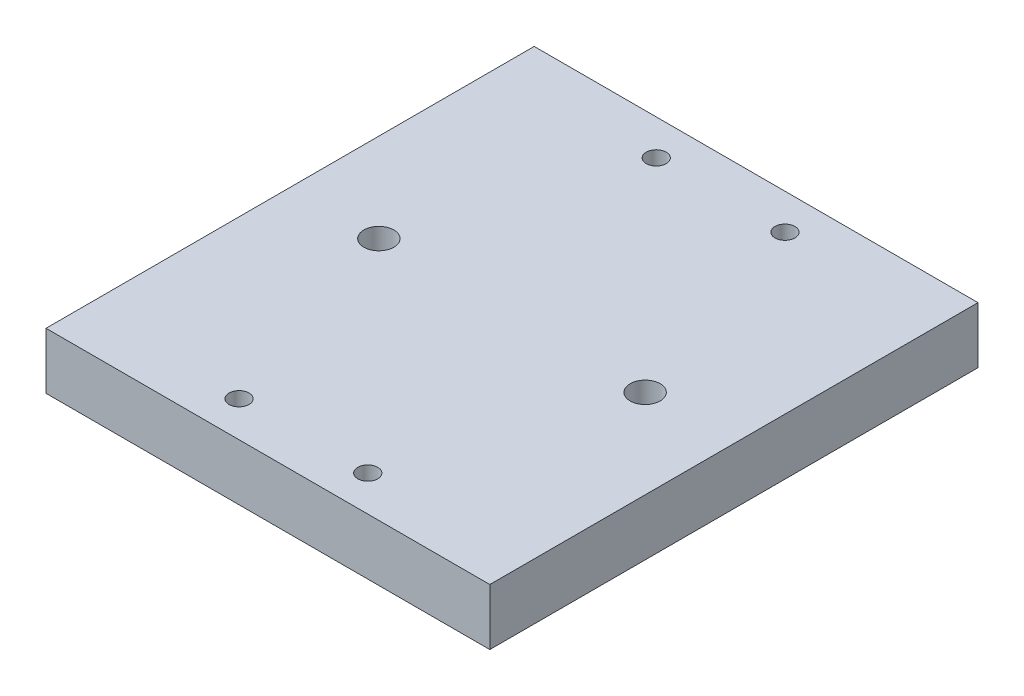
ISO-10303-21;
HEADER;
FILE_DESCRIPTION(('STEP AP214'),'2;1');
FILE_NAME('part.step','',(''),(''),'','','');
FILE_SCHEMA(('AUTOMOTIVE_DESIGN { 1 0 10303 214 1 1 1 1 }'));
ENDSEC;
DATA;
#1=APPLICATION_CONTEXT('core data for automotive mechanical design processes');
#2=APPLICATION_PROTOCOL_DEFINITION('international standard','automotive_design',2000,#1);
#3=PRODUCT_CONTEXT('',#1,'mechanical');
#4=PRODUCT('Part','Part','',(#3));
#5=PRODUCT_RELATED_PRODUCT_CATEGORY('part','',(#4));
#6=PRODUCT_DEFINITION_FORMATION('','',#4);
#7=PRODUCT_DEFINITION_CONTEXT('part definition',#1,'design');
#8=PRODUCT_DEFINITION('design','',#6,#7);
#9=PRODUCT_DEFINITION_SHAPE('','',#8);
#10=(LENGTH_UNIT() NAMED_UNIT(*) SI_UNIT(.MILLI.,.METRE.));
#11=(NAMED_UNIT(*) PLANE_ANGLE_UNIT() SI_UNIT($,.RADIAN.));
#12=(NAMED_UNIT(*) SI_UNIT($,.STERADIAN.) SOLID_ANGLE_UNIT());
#13=UNCERTAINTY_MEASURE_WITH_UNIT(LENGTH_MEASURE(1.E-05),#10,'distance_accuracy_value','');
#14=(GEOMETRIC_REPRESENTATION_CONTEXT(3) GLOBAL_UNCERTAINTY_ASSIGNED_CONTEXT((#13)) GLOBAL_UNIT_ASSIGNED_CONTEXT((#10,
#11,#12)) REPRESENTATION_CONTEXT('',''));
#15=CARTESIAN_POINT('',(0.,0.,0.));
#16=DIRECTION('',(0.,0.,1.));
#17=DIRECTION('',(1.,0.,0.));
#18=AXIS2_PLACEMENT_3D('',#15,#16,#17);
#19=CARTESIAN_POINT('',(-50.,6.35,55.));
#20=DIRECTION('',(1.,0.,0.));
#21=DIRECTION('',(0.,0.,-1.));
#22=AXIS2_PLACEMENT_3D('',#19,#20,#21);
#23=PLANE('',#22);
#24=DIRECTION('',(0.,-1.,0.));
#25=VECTOR('',#24,1.);
#26=CARTESIAN_POINT('',(-50.,6.35,-55.));
#27=LINE('',#26,#25);
#28=CARTESIAN_POINT('',(-50.,6.35,-55.));
#29=VERTEX_POINT('',#28);
#30=CARTESIAN_POINT('',(-50.,-6.35,-55.));
#31=VERTEX_POINT('',#30);
#32=EDGE_CURVE('E96',#29,#31,#27,.T.);
#33=ORIENTED_EDGE('',*,*,#32,.T.);
#34=DIRECTION('',(0.,0.,-1.));
#35=VECTOR('',#34,1.);
#36=CARTESIAN_POINT('',(-50.,-6.35,55.));
#37=LINE('',#36,#35);
#38=CARTESIAN_POINT('',(-50.,-6.35,55.));
#39=VERTEX_POINT('',#38);
#40=EDGE_CURVE('E11',#39,#31,#37,.T.);
#41=ORIENTED_EDGE('',*,*,#40,.F.);
#42=DIRECTION('',(0.,-1.,0.));
#43=VECTOR('',#42,1.);
#44=CARTESIAN_POINT('',(-50.,6.35,55.));
#45=LINE('',#44,#43);
#46=CARTESIAN_POINT('',(-50.,6.35,55.));
#47=VERTEX_POINT('',#46);
#48=EDGE_CURVE('E84',#47,#39,#45,.T.);
#49=ORIENTED_EDGE('',*,*,#48,.F.);
#50=DIRECTION('',(0.,0.,-1.));
#51=VECTOR('',#50,1.);
#52=CARTESIAN_POINT('',(-50.,6.35,55.));
#53=LINE('',#52,#51);
#54=EDGE_CURVE('E92',#47,#29,#53,.T.);
#55=ORIENTED_EDGE('',*,*,#54,.T.);
#56=EDGE_LOOP('',(#33,#41,#49,#55));
#57=FACE_BOUND('',#56,.T.);
#58=ADVANCED_FACE('F33',(#57),#23,.F.);
#59=CARTESIAN_POINT('',(50.,-6.34999999999999,55.));
#60=DIRECTION('',(0.,1.,0.));
#61=DIRECTION('',(-1.,0.,0.));
#62=AXIS2_PLACEMENT_3D('',#59,#60,#61);
#63=PLANE('',#62);
#64=CARTESIAN_POINT('',(-30.0000078911007,-6.35,-1.67118388853208E-06));
#65=DIRECTION('',(0.,-1.,0.));
#66=DIRECTION('',(0.,0.,-1.));
#67=AXIS2_PLACEMENT_3D('',#64,#65,#66);
#68=CIRCLE('',#67,5.55625);
#69=CARTESIAN_POINT('',(-30.0000078911007,-6.35,-5.55625167118389));
#70=VERTEX_POINT('',#69);
#71=EDGE_CURVE('E154',#70,#70,#68,.T.);
#72=ORIENTED_EDGE('',*,*,#71,.F.);
#73=EDGE_LOOP('',(#72));
#74=FACE_BOUND('',#73,.T.);
#75=CARTESIAN_POINT('',(29.9999921088993,-6.34999999999999,-1.67118389491202E-06));
#76=DIRECTION('',(0.,-1.,0.));
#77=DIRECTION('',(0.,0.,-1.));
#78=AXIS2_PLACEMENT_3D('',#75,#76,#77);
#79=CIRCLE('',#78,5.55625);
#80=CARTESIAN_POINT('',(29.9999921088993,-6.34999999999999,-5.55625167118389));
#81=VERTEX_POINT('',#80);
#82=EDGE_CURVE('E142',#81,#81,#79,.T.);
#83=ORIENTED_EDGE('',*,*,#82,.F.);
#84=EDGE_LOOP('',(#83));
#85=FACE_BOUND('',#84,.T.);
#86=CARTESIAN_POINT('',(14.5,-6.35000000000001,47.));
#87=DIRECTION('',(0.,1.,0.));
#88=DIRECTION('',(0.,0.,1.));
#89=AXIS2_PLACEMENT_3D('',#86,#87,#88);
#90=CIRCLE('',#89,2.25);
#91=CARTESIAN_POINT('',(14.5,-6.35000000000001,49.25));
#92=VERTEX_POINT('',#91);
#93=EDGE_CURVE('E127',#92,#92,#90,.T.);
#94=ORIENTED_EDGE('',*,*,#93,.T.);
#95=EDGE_LOOP('',(#94));
#96=FACE_BOUND('',#95,.T.);
#97=CARTESIAN_POINT('',(-14.5,-6.35000000000001,47.0000000000001));
#98=DIRECTION('',(0.,1.,0.));
#99=DIRECTION('',(0.,0.,1.));
#100=AXIS2_PLACEMENT_3D('',#97,#98,#99);
#101=CIRCLE('',#100,2.25);
#102=CARTESIAN_POINT('',(-14.5,-6.35000000000001,49.2500000000001));
#103=VERTEX_POINT('',#102);
#104=EDGE_CURVE('E121',#103,#103,#101,.T.);
#105=ORIENTED_EDGE('',*,*,#104,.T.);
#106=EDGE_LOOP('',(#105));
#107=FACE_BOUND('',#106,.T.);
#108=CARTESIAN_POINT('',(-14.5,-6.35000000000001,-46.9999999999999));
#109=DIRECTION('',(0.,1.,0.));
#110=DIRECTION('',(0.,0.,1.));
#111=AXIS2_PLACEMENT_3D('',#108,#109,#110);
#112=CIRCLE('',#111,2.25);
#113=CARTESIAN_POINT('',(-14.5,-6.35000000000001,-44.7499999999999));
#114=VERTEX_POINT('',#113);
#115=EDGE_CURVE('E115',#114,#114,#112,.T.);
#116=ORIENTED_EDGE('',*,*,#115,.T.);
#117=EDGE_LOOP('',(#116));
#118=FACE_BOUND('',#117,.T.);
#119=CARTESIAN_POINT('',(14.5,-6.35000000000001,-47.));
#120=DIRECTION('',(0.,1.,0.));
#121=DIRECTION('',(0.,0.,1.));
#122=AXIS2_PLACEMENT_3D('',#119,#120,#121);
#123=CIRCLE('',#122,2.25);
#124=CARTESIAN_POINT('',(14.5,-6.35000000000001,-44.75));
#125=VERTEX_POINT('',#124);
#126=EDGE_CURVE('E99',#125,#125,#123,.T.);
#127=ORIENTED_EDGE('',*,*,#126,.T.);
#128=EDGE_LOOP('',(#127));
#129=FACE_BOUND('',#128,.T.);
#130=DIRECTION('',(1.,0.,0.));
#131=VECTOR('',#130,1.);
#132=CARTESIAN_POINT('',(50.,-6.34999999999999,-55.));
#133=LINE('',#132,#131);
#134=CARTESIAN_POINT('',(50.,-6.34999999999999,-55.));
#135=VERTEX_POINT('',#134);
#136=EDGE_CURVE('E88',#31,#135,#133,.T.);
#137=ORIENTED_EDGE('',*,*,#136,.T.);
#138=DIRECTION('',(0.,0.,-1.));
#139=VECTOR('',#138,1.);
#140=CARTESIAN_POINT('',(50.,-6.34999999999999,55.));
#141=LINE('',#140,#139);
#142=CARTESIAN_POINT('',(50.,-6.34999999999999,55.));
#143=VERTEX_POINT('',#142);
#144=EDGE_CURVE('E41',#143,#135,#141,.T.);
#145=ORIENTED_EDGE('',*,*,#144,.F.);
#146=DIRECTION('',(1.,0.,0.));
#147=VECTOR('',#146,1.);
#148=CARTESIAN_POINT('',(50.,-6.34999999999999,55.));
#149=LINE('',#148,#147);
#150=EDGE_CURVE('E79',#39,#143,#149,.T.);
#151=ORIENTED_EDGE('',*,*,#150,.F.);
#152=ORIENTED_EDGE('',*,*,#40,.T.);
#153=EDGE_LOOP('',(#137,#145,#151,#152));
#154=FACE_BOUND('',#153,.T.);
#155=ADVANCED_FACE('F87',(#74,#85,#96,#107,#118,#129,#154),#63,.F.);
#156=CARTESIAN_POINT('',(50.,6.35000000000001,55.));
#157=DIRECTION('',(-1.,0.,0.));
#158=DIRECTION('',(0.,0.,1.));
#159=AXIS2_PLACEMENT_3D('',#156,#157,#158);
#160=PLANE('',#159);
#161=DIRECTION('',(0.,1.,0.));
#162=VECTOR('',#161,1.);
#163=CARTESIAN_POINT('',(50.,6.35000000000001,-55.));
#164=LINE('',#163,#162);
#165=CARTESIAN_POINT('',(50.,6.35000000000001,-55.));
#166=VERTEX_POINT('',#165);
#167=EDGE_CURVE('E66',#135,#166,#164,.T.);
#168=ORIENTED_EDGE('',*,*,#167,.T.);
#169=DIRECTION('',(0.,0.,-1.));
#170=VECTOR('',#169,1.);
#171=CARTESIAN_POINT('',(50.,6.35000000000001,55.));
#172=LINE('',#171,#170);
#173=CARTESIAN_POINT('',(50.,6.35000000000001,55.));
#174=VERTEX_POINT('',#173);
#175=EDGE_CURVE('E89',#174,#166,#172,.T.);
#176=ORIENTED_EDGE('',*,*,#175,.F.);
#177=DIRECTION('',(0.,1.,0.));
#178=VECTOR('',#177,1.);
#179=CARTESIAN_POINT('',(50.,6.35000000000001,55.));
#180=LINE('',#179,#178);
#181=EDGE_CURVE('E82',#143,#174,#180,.T.);
#182=ORIENTED_EDGE('',*,*,#181,.F.);
#183=ORIENTED_EDGE('',*,*,#144,.T.);
#184=EDGE_LOOP('',(#168,#176,#182,#183));
#185=FACE_BOUND('',#184,.T.);
#186=ADVANCED_FACE('F90',(#185),#160,.F.);
#187=CARTESIAN_POINT('',(50.,6.35000000000001,55.));
#188=DIRECTION('',(0.,-1.,0.));
#189=DIRECTION('',(1.,0.,0.));
#190=AXIS2_PLACEMENT_3D('',#187,#188,#189);
#191=PLANE('',#190);
#192=CARTESIAN_POINT('',(-30.0000078911007,6.35000000000013,-1.67118388853208E-06));
#193=DIRECTION('',(0.,-1.,0.));
#194=DIRECTION('',(0.,0.,-1.));
#195=AXIS2_PLACEMENT_3D('',#192,#193,#194);
#196=CIRCLE('',#195,3.3782);
#197=CARTESIAN_POINT('',(-30.0000078911007,6.35000000000013,-3.37820167118389));
#198=VERTEX_POINT('',#197);
#199=EDGE_CURVE('E145',#198,#198,#196,.T.);
#200=ORIENTED_EDGE('',*,*,#199,.T.);
#201=EDGE_LOOP('',(#200));
#202=FACE_BOUND('',#201,.T.);
#203=CARTESIAN_POINT('',(29.9999921088993,6.35000000000014,-1.67118389491202E-06));
#204=DIRECTION('',(0.,-1.,0.));
#205=DIRECTION('',(0.,0.,-1.));
#206=AXIS2_PLACEMENT_3D('',#203,#204,#205);
#207=CIRCLE('',#206,3.3782);
#208=CARTESIAN_POINT('',(29.9999921088993,6.35000000000014,-3.37820167118389));
#209=VERTEX_POINT('',#208);
#210=EDGE_CURVE('E133',#209,#209,#207,.T.);
#211=ORIENTED_EDGE('',*,*,#210,.T.);
#212=EDGE_LOOP('',(#211));
#213=FACE_BOUND('',#212,.T.);
#214=CARTESIAN_POINT('',(14.5,6.35,47.));
#215=DIRECTION('',(0.,1.,0.));
#216=DIRECTION('',(0.,0.,1.));
#217=AXIS2_PLACEMENT_3D('',#214,#215,#216);
#218=CIRCLE('',#217,2.24999999999999);
#219=CARTESIAN_POINT('',(14.5,6.35,49.25));
#220=VERTEX_POINT('',#219);
#221=EDGE_CURVE('E130',#220,#220,#218,.T.);
#222=ORIENTED_EDGE('',*,*,#221,.F.);
#223=EDGE_LOOP('',(#222));
#224=FACE_BOUND('',#223,.T.);
#225=CARTESIAN_POINT('',(-14.5,6.35,47.0000000000001));
#226=DIRECTION('',(0.,1.,0.));
#227=DIRECTION('',(0.,0.,1.));
#228=AXIS2_PLACEMENT_3D('',#225,#226,#227);
#229=CIRCLE('',#228,2.24999999999999);
#230=CARTESIAN_POINT('',(-14.5,6.35,49.2500000000001));
#231=VERTEX_POINT('',#230);
#232=EDGE_CURVE('E124',#231,#231,#229,.T.);
#233=ORIENTED_EDGE('',*,*,#232,.F.);
#234=EDGE_LOOP('',(#233));
#235=FACE_BOUND('',#234,.T.);
#236=CARTESIAN_POINT('',(-14.5,6.35,-46.9999999999999));
#237=DIRECTION('',(0.,1.,0.));
#238=DIRECTION('',(0.,0.,1.));
#239=AXIS2_PLACEMENT_3D('',#236,#237,#238);
#240=CIRCLE('',#239,2.24999999999999);
#241=CARTESIAN_POINT('',(-14.5,6.35,-44.7499999999999));
#242=VERTEX_POINT('',#241);
#243=EDGE_CURVE('E118',#242,#242,#240,.T.);
#244=ORIENTED_EDGE('',*,*,#243,.F.);
#245=EDGE_LOOP('',(#244));
#246=FACE_BOUND('',#245,.T.);
#247=CARTESIAN_POINT('',(14.5,6.35,-47.));
#248=DIRECTION('',(0.,1.,0.));
#249=DIRECTION('',(0.,0.,1.));
#250=AXIS2_PLACEMENT_3D('',#247,#248,#249);
#251=CIRCLE('',#250,2.24999999999999);
#252=CARTESIAN_POINT('',(14.5,6.35,-44.75));
#253=VERTEX_POINT('',#252);
#254=EDGE_CURVE('E112',#253,#253,#251,.T.);
#255=ORIENTED_EDGE('',*,*,#254,.F.);
#256=EDGE_LOOP('',(#255));
#257=FACE_BOUND('',#256,.T.);
#258=DIRECTION('',(-1.,0.,0.));
#259=VECTOR('',#258,1.);
#260=CARTESIAN_POINT('',(50.,6.35000000000001,-55.));
#261=LINE('',#260,#259);
#262=EDGE_CURVE('E72',#166,#29,#261,.T.);
#263=ORIENTED_EDGE('',*,*,#262,.T.);
#264=ORIENTED_EDGE('',*,*,#54,.F.);
#265=DIRECTION('',(-1.,0.,0.));
#266=VECTOR('',#265,1.);
#267=CARTESIAN_POINT('',(50.,6.35000000000001,55.));
#268=LINE('',#267,#266);
#269=EDGE_CURVE('E49',#174,#47,#268,.T.);
#270=ORIENTED_EDGE('',*,*,#269,.F.);
#271=ORIENTED_EDGE('',*,*,#175,.T.);
#272=EDGE_LOOP('',(#263,#264,#270,#271));
#273=FACE_BOUND('',#272,.T.);
#274=ADVANCED_FACE('F104',(#202,#213,#224,#235,#246,#257,#273),#191,.F.);
#275=CARTESIAN_POINT('',(0.,0.,55.));
#276=DIRECTION('',(0.,0.,-1.));
#277=DIRECTION('',(-1.,0.,0.));
#278=AXIS2_PLACEMENT_3D('',#275,#276,#277);
#279=PLANE('',#278);
#280=ORIENTED_EDGE('',*,*,#48,.T.);
#281=ORIENTED_EDGE('',*,*,#150,.T.);
#282=ORIENTED_EDGE('',*,*,#181,.T.);
#283=ORIENTED_EDGE('',*,*,#269,.T.);
#284=EDGE_LOOP('',(#280,#281,#282,#283));
#285=FACE_BOUND('',#284,.T.);
#286=ADVANCED_FACE('F80',(#285),#279,.F.);
#287=CARTESIAN_POINT('',(0.,0.,-55.));
#288=DIRECTION('',(0.,0.,-1.));
#289=DIRECTION('',(-1.,0.,0.));
#290=AXIS2_PLACEMENT_3D('',#287,#288,#289);
#291=PLANE('',#290);
#292=ORIENTED_EDGE('',*,*,#32,.F.);
#293=ORIENTED_EDGE('',*,*,#262,.F.);
#294=ORIENTED_EDGE('',*,*,#167,.F.);
#295=ORIENTED_EDGE('',*,*,#136,.F.);
#296=EDGE_LOOP('',(#292,#293,#294,#295));
#297=FACE_BOUND('',#296,.T.);
#298=ADVANCED_FACE('F107',(#297),#291,.T.);
#299=CARTESIAN_POINT('',(14.5,6.35,-47.));
#300=DIRECTION('',(0.,1.,0.));
#301=DIRECTION('',(0.,0.,1.));
#302=AXIS2_PLACEMENT_3D('',#299,#300,#301);
#303=CYLINDRICAL_SURFACE('',#302,2.24999999999999);
#304=ORIENTED_EDGE('',*,*,#126,.F.);
#305=EDGE_LOOP('',(#304));
#306=FACE_BOUND('',#305,.T.);
#307=ORIENTED_EDGE('',*,*,#254,.T.);
#308=EDGE_LOOP('',(#307));
#309=FACE_BOUND('',#308,.T.);
#310=ADVANCED_FACE('F172',(#306,#309),#303,.F.);
#311=CARTESIAN_POINT('',(-14.5,6.35,-46.9999999999999));
#312=DIRECTION('',(0.,1.,0.));
#313=DIRECTION('',(0.,0.,1.));
#314=AXIS2_PLACEMENT_3D('',#311,#312,#313);
#315=CYLINDRICAL_SURFACE('',#314,2.24999999999999);
#316=ORIENTED_EDGE('',*,*,#115,.F.);
#317=EDGE_LOOP('',(#316));
#318=FACE_BOUND('',#317,.T.);
#319=ORIENTED_EDGE('',*,*,#243,.T.);
#320=EDGE_LOOP('',(#319));
#321=FACE_BOUND('',#320,.T.);
#322=ADVANCED_FACE('F175',(#318,#321),#315,.F.);
#323=CARTESIAN_POINT('',(-14.5,6.35,47.0000000000001));
#324=DIRECTION('',(0.,1.,0.));
#325=DIRECTION('',(0.,0.,1.));
#326=AXIS2_PLACEMENT_3D('',#323,#324,#325);
#327=CYLINDRICAL_SURFACE('',#326,2.24999999999999);
#328=ORIENTED_EDGE('',*,*,#104,.F.);
#329=EDGE_LOOP('',(#328));
#330=FACE_BOUND('',#329,.T.);
#331=ORIENTED_EDGE('',*,*,#232,.T.);
#332=EDGE_LOOP('',(#331));
#333=FACE_BOUND('',#332,.T.);
#334=ADVANCED_FACE('F231',(#330,#333),#327,.F.);
#335=CARTESIAN_POINT('',(14.5,6.35,47.));
#336=DIRECTION('',(0.,1.,0.));
#337=DIRECTION('',(0.,0.,1.));
#338=AXIS2_PLACEMENT_3D('',#335,#336,#337);
#339=CYLINDRICAL_SURFACE('',#338,2.24999999999999);
#340=ORIENTED_EDGE('',*,*,#93,.F.);
#341=EDGE_LOOP('',(#340));
#342=FACE_BOUND('',#341,.T.);
#343=ORIENTED_EDGE('',*,*,#221,.T.);
#344=EDGE_LOOP('',(#343));
#345=FACE_BOUND('',#344,.T.);
#346=ADVANCED_FACE('F240',(#342,#345),#339,.F.);
#347=CARTESIAN_POINT('',(29.9999921088993,-6.34999999999999,-1.67118389491202E-06));
#348=DIRECTION('',(0.,-1.,0.));
#349=DIRECTION('',(0.,0.,-1.));
#350=AXIS2_PLACEMENT_3D('',#347,#348,#349);
#351=CYLINDRICAL_SURFACE('',#350,3.3782);
#352=ORIENTED_EDGE('',*,*,#210,.F.);
#353=EDGE_LOOP('',(#352));
#354=FACE_BOUND('',#353,.T.);
#355=CARTESIAN_POINT('',(29.9999921088993,0.,-1.67118389491202E-06));
#356=DIRECTION('',(0.,-1.,0.));
#357=DIRECTION('',(0.,0.,-1.));
#358=AXIS2_PLACEMENT_3D('',#355,#356,#357);
#359=CIRCLE('',#358,3.3782);
#360=CARTESIAN_POINT('',(29.9999921088993,0.,-3.37820167118389));
#361=VERTEX_POINT('',#360);
#362=EDGE_CURVE('E136',#361,#361,#359,.T.);
#363=ORIENTED_EDGE('',*,*,#362,.T.);
#364=EDGE_LOOP('',(#363));
#365=FACE_BOUND('',#364,.T.);
#366=ADVANCED_FACE('F249',(#354,#365),#351,.F.);
#367=CARTESIAN_POINT('',(33.3781921088993,0.,-1.67118389491202E-06));
#368=DIRECTION('',(0.,1.,0.));
#369=DIRECTION('',(0.,0.,1.));
#370=AXIS2_PLACEMENT_3D('',#367,#368,#369);
#371=PLANE('',#370);
#372=ORIENTED_EDGE('',*,*,#362,.F.);
#373=EDGE_LOOP('',(#372));
#374=FACE_BOUND('',#373,.T.);
#375=CARTESIAN_POINT('',(29.9999921088993,0.,-1.67118389491202E-06));
#376=DIRECTION('',(0.,-1.,0.));
#377=DIRECTION('',(0.,0.,-1.));
#378=AXIS2_PLACEMENT_3D('',#375,#376,#377);
#379=CIRCLE('',#378,5.55625);
#380=CARTESIAN_POINT('',(29.9999921088993,0.,-5.55625167118389));
#381=VERTEX_POINT('',#380);
#382=EDGE_CURVE('E139',#381,#381,#379,.T.);
#383=ORIENTED_EDGE('',*,*,#382,.T.);
#384=EDGE_LOOP('',(#383));
#385=FACE_BOUND('',#384,.T.);
#386=ADVANCED_FACE('F260',(#374,#385),#371,.F.);
#387=CARTESIAN_POINT('',(29.9999921088993,-6.34999999999999,-1.67118389491202E-06));
#388=DIRECTION('',(0.,-1.,0.));
#389=DIRECTION('',(0.,0.,-1.));
#390=AXIS2_PLACEMENT_3D('',#387,#388,#389);
#391=CYLINDRICAL_SURFACE('',#390,5.55625);
#392=ORIENTED_EDGE('',*,*,#382,.F.);
#393=EDGE_LOOP('',(#392));
#394=FACE_BOUND('',#393,.T.);
#395=ORIENTED_EDGE('',*,*,#82,.T.);
#396=EDGE_LOOP('',(#395));
#397=FACE_BOUND('',#396,.T.);
#398=ADVANCED_FACE('F267',(#394,#397),#391,.F.);
#399=CARTESIAN_POINT('',(-30.0000078911007,-6.35,-1.67118388853208E-06));
#400=DIRECTION('',(0.,-1.,0.));
#401=DIRECTION('',(0.,0.,-1.));
#402=AXIS2_PLACEMENT_3D('',#399,#400,#401);
#403=CYLINDRICAL_SURFACE('',#402,3.3782);
#404=ORIENTED_EDGE('',*,*,#199,.F.);
#405=EDGE_LOOP('',(#404));
#406=FACE_BOUND('',#405,.T.);
#407=CARTESIAN_POINT('',(-30.0000078911007,0.,-1.67118388853208E-06));
#408=DIRECTION('',(0.,-1.,0.));
#409=DIRECTION('',(0.,0.,-1.));
#410=AXIS2_PLACEMENT_3D('',#407,#408,#409);
#411=CIRCLE('',#410,3.3782);
#412=CARTESIAN_POINT('',(-30.0000078911007,0.,-3.37820167118389));
#413=VERTEX_POINT('',#412);
#414=EDGE_CURVE('E148',#413,#413,#411,.T.);
#415=ORIENTED_EDGE('',*,*,#414,.T.);
#416=EDGE_LOOP('',(#415));
#417=FACE_BOUND('',#416,.T.);
#418=ADVANCED_FACE('F275',(#406,#417),#403,.F.);
#419=CARTESIAN_POINT('',(-26.6218078911007,0.,-1.67118388853208E-06));
#420=DIRECTION('',(0.,1.,0.));
#421=DIRECTION('',(0.,0.,1.));
#422=AXIS2_PLACEMENT_3D('',#419,#420,#421);
#423=PLANE('',#422);
#424=ORIENTED_EDGE('',*,*,#414,.F.);
#425=EDGE_LOOP('',(#424));
#426=FACE_BOUND('',#425,.T.);
#427=CARTESIAN_POINT('',(-30.0000078911007,0.,-1.67118388853208E-06));
#428=DIRECTION('',(0.,-1.,0.));
#429=DIRECTION('',(0.,0.,-1.));
#430=AXIS2_PLACEMENT_3D('',#427,#428,#429);
#431=CIRCLE('',#430,5.55625);
#432=CARTESIAN_POINT('',(-30.0000078911007,0.,-5.55625167118389));
#433=VERTEX_POINT('',#432);
#434=EDGE_CURVE('E151',#433,#433,#431,.T.);
#435=ORIENTED_EDGE('',*,*,#434,.T.);
#436=EDGE_LOOP('',(#435));
#437=FACE_BOUND('',#436,.T.);
#438=ADVANCED_FACE('F283',(#426,#437),#423,.F.);
#439=CARTESIAN_POINT('',(-30.0000078911007,-6.35,-1.67118388853208E-06));
#440=DIRECTION('',(0.,-1.,0.));
#441=DIRECTION('',(0.,0.,-1.));
#442=AXIS2_PLACEMENT_3D('',#439,#440,#441);
#443=CYLINDRICAL_SURFACE('',#442,5.55625);
#444=ORIENTED_EDGE('',*,*,#434,.F.);
#445=EDGE_LOOP('',(#444));
#446=FACE_BOUND('',#445,.T.);
#447=ORIENTED_EDGE('',*,*,#71,.T.);
#448=EDGE_LOOP('',(#447));
#449=FACE_BOUND('',#448,.T.);
#450=ADVANCED_FACE('F158',(#446,#449),#443,.F.);
#451=CLOSED_SHELL('',(#58,#155,#186,#274,#286,#298,#310,#322,#334,#346,#366,#386,#398,#418,#438,#450));
#452=MANIFOLD_SOLID_BREP('B2',#451);
#453=ADVANCED_BREP_SHAPE_REPRESENTATION('',(#18,#452),#14);
#454=SHAPE_DEFINITION_REPRESENTATION(#9,#453);
ENDSEC;
END-ISO-10303-21;
